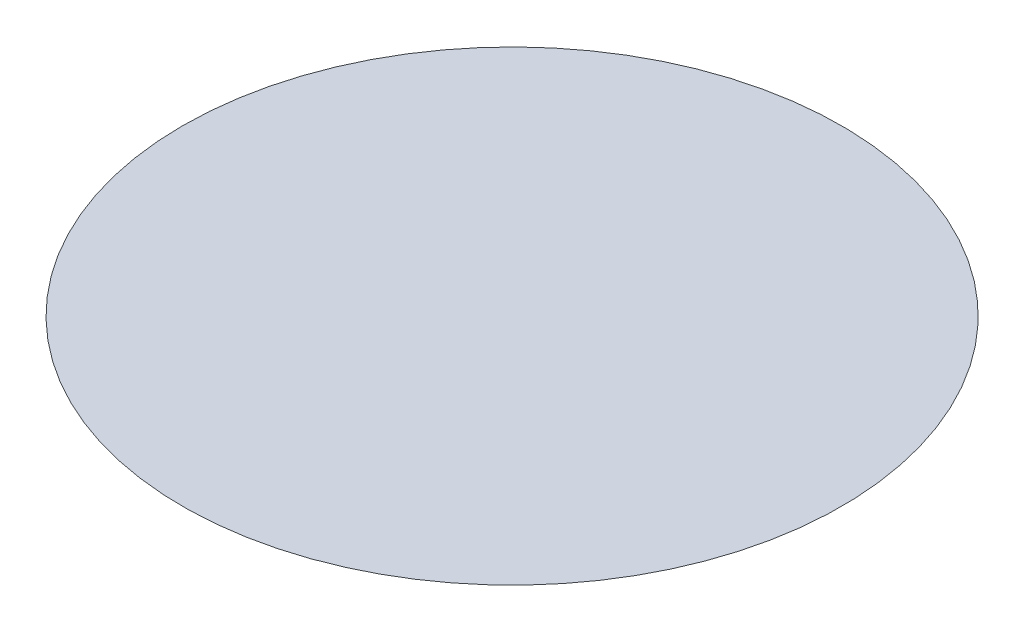
ISO-10303-21;
HEADER;
FILE_DESCRIPTION(('STEP AP214'),'2;1');
FILE_NAME('part.step','',(''),(''),'','','');
FILE_SCHEMA(('AUTOMOTIVE_DESIGN { 1 0 10303 214 1 1 1 1 }'));
ENDSEC;
DATA;
#1=APPLICATION_CONTEXT('core data for automotive mechanical design processes');
#2=APPLICATION_PROTOCOL_DEFINITION('international standard','automotive_design',2000,#1);
#3=PRODUCT_CONTEXT('',#1,'mechanical');
#4=PRODUCT('Part','Part','',(#3));
#5=PRODUCT_RELATED_PRODUCT_CATEGORY('part','',(#4));
#6=PRODUCT_DEFINITION_FORMATION('','',#4);
#7=PRODUCT_DEFINITION_CONTEXT('part definition',#1,'design');
#8=PRODUCT_DEFINITION('design','',#6,#7);
#9=PRODUCT_DEFINITION_SHAPE('','',#8);
#10=(LENGTH_UNIT() NAMED_UNIT(*) SI_UNIT(.MILLI.,.METRE.));
#11=(NAMED_UNIT(*) PLANE_ANGLE_UNIT() SI_UNIT($,.RADIAN.));
#12=(NAMED_UNIT(*) SI_UNIT($,.STERADIAN.) SOLID_ANGLE_UNIT());
#13=UNCERTAINTY_MEASURE_WITH_UNIT(LENGTH_MEASURE(1.E-05),#10,'distance_accuracy_value','');
#14=(GEOMETRIC_REPRESENTATION_CONTEXT(3) GLOBAL_UNCERTAINTY_ASSIGNED_CONTEXT((#13)) GLOBAL_UNIT_ASSIGNED_CONTEXT((#10,
#11,#12)) REPRESENTATION_CONTEXT('',''));
#15=CARTESIAN_POINT('',(0.,0.,0.));
#16=DIRECTION('',(0.,0.,1.));
#17=DIRECTION('',(1.,0.,0.));
#18=AXIS2_PLACEMENT_3D('',#15,#16,#17);
#19=CARTESIAN_POINT('',(0.,-1.,0.));
#20=DIRECTION('',(0.,1.,0.));
#21=DIRECTION('',(-1.,0.,0.));
#22=AXIS2_PLACEMENT_3D('',#19,#20,#21);
#23=PLANE('',#22);
#24=CARTESIAN_POINT('',(0.,-1.,0.));
#25=DIRECTION('',(0.,1.,0.));
#26=DIRECTION('',(-1.,0.,0.));
#27=AXIS2_PLACEMENT_3D('',#24,#25,#26);
#28=CIRCLE('',#27,3.04176198925072);
#29=CARTESIAN_POINT('',(-3.04176198925072,-1.,0.));
#30=VERTEX_POINT('',#29);
#31=EDGE_CURVE('E11',#30,#30,#28,.T.);
#32=ORIENTED_EDGE('',*,*,#31,.F.);
#33=EDGE_LOOP('',(#32));
#34=FACE_BOUND('',#33,.T.);
#35=ADVANCED_FACE('F38',(#34),#23,.F.);
#36=CARTESIAN_POINT('',(0.,-0.2,0.));
#37=DIRECTION('',(0.,1.,0.));
#38=DIRECTION('',(-1.,0.,0.));
#39=AXIS2_PLACEMENT_3D('',#36,#37,#38);
#40=TOROIDAL_SURFACE('',#39,3.04176198925072,0.8);
#41=CARTESIAN_POINT('',(0.,-0.71423008774923,0.));
#42=DIRECTION('',(0.,1.,0.));
#43=DIRECTION('',(-1.,0.,0.));
#44=AXIS2_PLACEMENT_3D('',#41,#42,#43);
#45=CIRCLE('',#44,3.65459754374591);
#46=CARTESIAN_POINT('',(-3.65459754374591,-0.714230087749231,0.));
#47=VERTEX_POINT('',#46);
#48=EDGE_CURVE('E44',#47,#47,#45,.T.);
#49=ORIENTED_EDGE('',*,*,#48,.F.);
#50=EDGE_LOOP('',(#49));
#51=FACE_BOUND('',#50,.T.);
#52=ORIENTED_EDGE('',*,*,#31,.T.);
#53=EDGE_LOOP('',(#52));
#54=FACE_BOUND('',#53,.T.);
#55=ADVANCED_FACE('F68',(#51,#54),#40,.T.);
#56=CARTESIAN_POINT('',(0.,-0.71423008774923,0.));
#57=DIRECTION('',(0.,1.,0.));
#58=DIRECTION('',(-1.,0.,0.));
#59=AXIS2_PLACEMENT_3D('',#56,#57,#58);
#60=CONICAL_SURFACE('',#59,3.65459754374591,0.698131700797729);
#61=CARTESIAN_POINT('',(0.,-0.571539824501541,0.));
#62=DIRECTION('',(0.,1.,0.));
#63=DIRECTION('',(-1.,0.,0.));
#64=AXIS2_PLACEMENT_3D('',#61,#62,#63);
#65=CIRCLE('',#64,3.77432889100963);
#66=CARTESIAN_POINT('',(-3.77432889100963,-0.571539824501541,0.));
#67=VERTEX_POINT('',#66);
#68=EDGE_CURVE('E48',#67,#67,#65,.T.);
#69=ORIENTED_EDGE('',*,*,#68,.F.);
#70=EDGE_LOOP('',(#69));
#71=FACE_BOUND('',#70,.T.);
#72=ORIENTED_EDGE('',*,*,#48,.T.);
#73=EDGE_LOOP('',(#72));
#74=FACE_BOUND('',#73,.T.);
#75=ADVANCED_FACE('F63',(#71,#74),#60,.T.);
#76=CARTESIAN_POINT('',(0.,-1.6,0.));
#77=DIRECTION('',(0.,1.,0.));
#78=DIRECTION('',(-1.,0.,0.));
#79=AXIS2_PLACEMENT_3D('',#76,#77,#78);
#80=TOROIDAL_SURFACE('',#79,5.,1.6);
#81=CARTESIAN_POINT('',(0.,0.,0.));
#82=DIRECTION('',(0.,1.,0.));
#83=DIRECTION('',(-1.,0.,0.));
#84=AXIS2_PLACEMENT_3D('',#81,#82,#83);
#85=CIRCLE('',#84,5.);
#86=CARTESIAN_POINT('',(-5.,0.,0.));
#87=VERTEX_POINT('',#86);
#88=EDGE_CURVE('E52',#87,#87,#85,.T.);
#89=ORIENTED_EDGE('',*,*,#88,.F.);
#90=EDGE_LOOP('',(#89));
#91=FACE_BOUND('',#90,.T.);
#92=ORIENTED_EDGE('',*,*,#68,.T.);
#93=EDGE_LOOP('',(#92));
#94=FACE_BOUND('',#93,.T.);
#95=ADVANCED_FACE('F60',(#91,#94),#80,.F.);
#96=CARTESIAN_POINT('',(5.,0.,0.));
#97=DIRECTION('',(0.,-1.,0.));
#98=DIRECTION('',(1.,0.,0.));
#99=AXIS2_PLACEMENT_3D('',#96,#97,#98);
#100=PLANE('',#99);
#101=ORIENTED_EDGE('',*,*,#88,.T.);
#102=EDGE_LOOP('',(#101));
#103=FACE_BOUND('',#102,.T.);
#104=ADVANCED_FACE('F58',(#103),#100,.F.);
#105=CLOSED_SHELL('',(#35,#55,#75,#95,#104));
#106=MANIFOLD_SOLID_BREP('B2',#105);
#107=ADVANCED_BREP_SHAPE_REPRESENTATION('',(#18,#106),#14);
#108=SHAPE_DEFINITION_REPRESENTATION(#9,#107);
ENDSEC;
END-ISO-10303-21;
